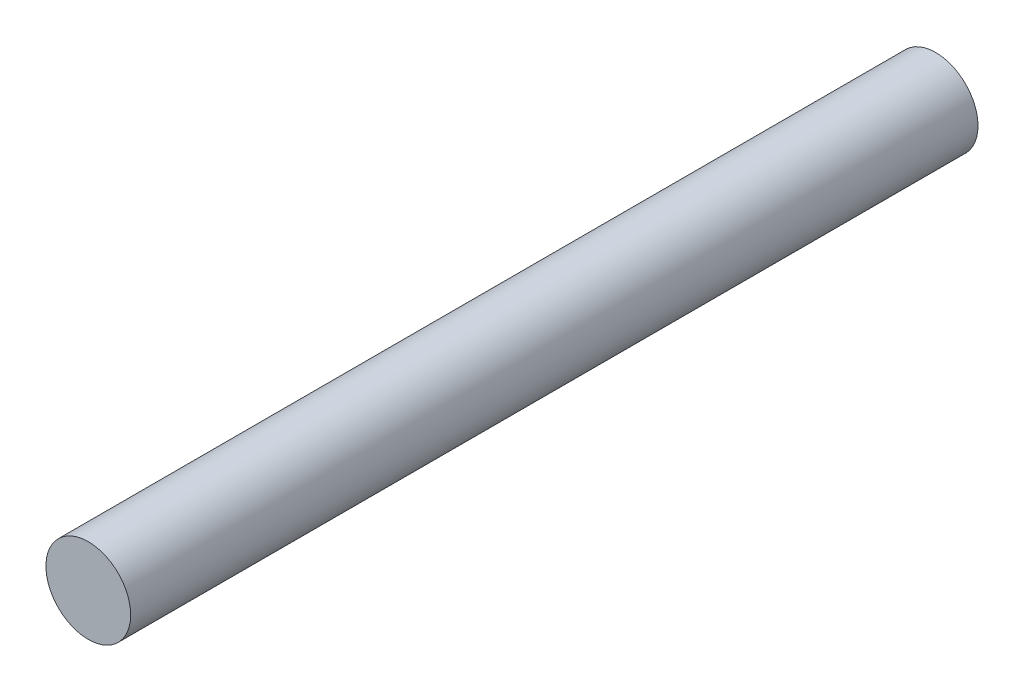
ISO-10303-21;
HEADER;
FILE_DESCRIPTION(('STEP AP214'),'2;1');
FILE_NAME('part.step','',(''),(''),'','','');
FILE_SCHEMA(('AUTOMOTIVE_DESIGN { 1 0 10303 214 1 1 1 1 }'));
ENDSEC;
DATA;
#1=APPLICATION_CONTEXT('core data for automotive mechanical design processes');
#2=APPLICATION_PROTOCOL_DEFINITION('international standard','automotive_design',2000,#1);
#3=PRODUCT_CONTEXT('',#1,'mechanical');
#4=PRODUCT('Part','Part','',(#3));
#5=PRODUCT_RELATED_PRODUCT_CATEGORY('part','',(#4));
#6=PRODUCT_DEFINITION_FORMATION('','',#4);
#7=PRODUCT_DEFINITION_CONTEXT('part definition',#1,'design');
#8=PRODUCT_DEFINITION('design','',#6,#7);
#9=PRODUCT_DEFINITION_SHAPE('','',#8);
#10=(LENGTH_UNIT() NAMED_UNIT(*) SI_UNIT(.MILLI.,.METRE.));
#11=(NAMED_UNIT(*) PLANE_ANGLE_UNIT() SI_UNIT($,.RADIAN.));
#12=(NAMED_UNIT(*) SI_UNIT($,.STERADIAN.) SOLID_ANGLE_UNIT());
#13=UNCERTAINTY_MEASURE_WITH_UNIT(LENGTH_MEASURE(1.E-05),#10,'distance_accuracy_value','');
#14=(GEOMETRIC_REPRESENTATION_CONTEXT(3) GLOBAL_UNCERTAINTY_ASSIGNED_CONTEXT((#13)) GLOBAL_UNIT_ASSIGNED_CONTEXT((#10,
#11,#12)) REPRESENTATION_CONTEXT('',''));
#15=CARTESIAN_POINT('',(0.,0.,0.));
#16=DIRECTION('',(0.,0.,1.));
#17=DIRECTION('',(1.,0.,0.));
#18=AXIS2_PLACEMENT_3D('',#15,#16,#17);
#19=CARTESIAN_POINT('',(0.,0.,10000.));
#20=DIRECTION('',(0.,0.,-1.));
#21=DIRECTION('',(-1.,0.,0.));
#22=AXIS2_PLACEMENT_3D('',#19,#20,#21);
#23=CYLINDRICAL_SURFACE('',#22,500.);
#24=CARTESIAN_POINT('',(0.,0.,10000.));
#25=DIRECTION('',(0.,0.,1.));
#26=DIRECTION('',(1.,0.,0.));
#27=AXIS2_PLACEMENT_3D('',#24,#25,#26);
#28=CIRCLE('',#27,500.);
#29=CARTESIAN_POINT('',(500.,0.,10000.));
#30=VERTEX_POINT('',#29);
#31=EDGE_CURVE('E10',#30,#30,#28,.T.);
#32=ORIENTED_EDGE('',*,*,#31,.F.);
#33=EDGE_LOOP('',(#32));
#34=FACE_BOUND('',#33,.T.);
#35=CARTESIAN_POINT('',(0.,0.,0.));
#36=DIRECTION('',(0.,0.,1.));
#37=DIRECTION('',(1.,0.,0.));
#38=AXIS2_PLACEMENT_3D('',#35,#36,#37);
#39=CIRCLE('',#38,500.);
#40=CARTESIAN_POINT('',(500.,0.,0.));
#41=VERTEX_POINT('',#40);
#42=EDGE_CURVE('E34',#41,#41,#39,.T.);
#43=ORIENTED_EDGE('',*,*,#42,.T.);
#44=EDGE_LOOP('',(#43));
#45=FACE_BOUND('',#44,.T.);
#46=ADVANCED_FACE('F31',(#34,#45),#23,.T.);
#47=CARTESIAN_POINT('',(0.,0.,10000.));
#48=DIRECTION('',(0.,0.,1.));
#49=DIRECTION('',(1.,0.,0.));
#50=AXIS2_PLACEMENT_3D('',#47,#48,#49);
#51=PLANE('',#50);
#52=ORIENTED_EDGE('',*,*,#31,.T.);
#53=EDGE_LOOP('',(#52));
#54=FACE_BOUND('',#53,.T.);
#55=ADVANCED_FACE('F46',(#54),#51,.T.);
#56=CARTESIAN_POINT('',(0.,0.,0.));
#57=DIRECTION('',(0.,0.,1.));
#58=DIRECTION('',(1.,0.,0.));
#59=AXIS2_PLACEMENT_3D('',#56,#57,#58);
#60=PLANE('',#59);
#61=ORIENTED_EDGE('',*,*,#42,.F.);
#62=EDGE_LOOP('',(#61));
#63=FACE_BOUND('',#62,.T.);
#64=ADVANCED_FACE('F44',(#63),#60,.F.);
#65=CLOSED_SHELL('',(#46,#55,#64));
#66=MANIFOLD_SOLID_BREP('B2',#65);
#67=ADVANCED_BREP_SHAPE_REPRESENTATION('',(#18,#66),#14);
#68=SHAPE_DEFINITION_REPRESENTATION(#9,#67);
ENDSEC;
END-ISO-10303-21;
